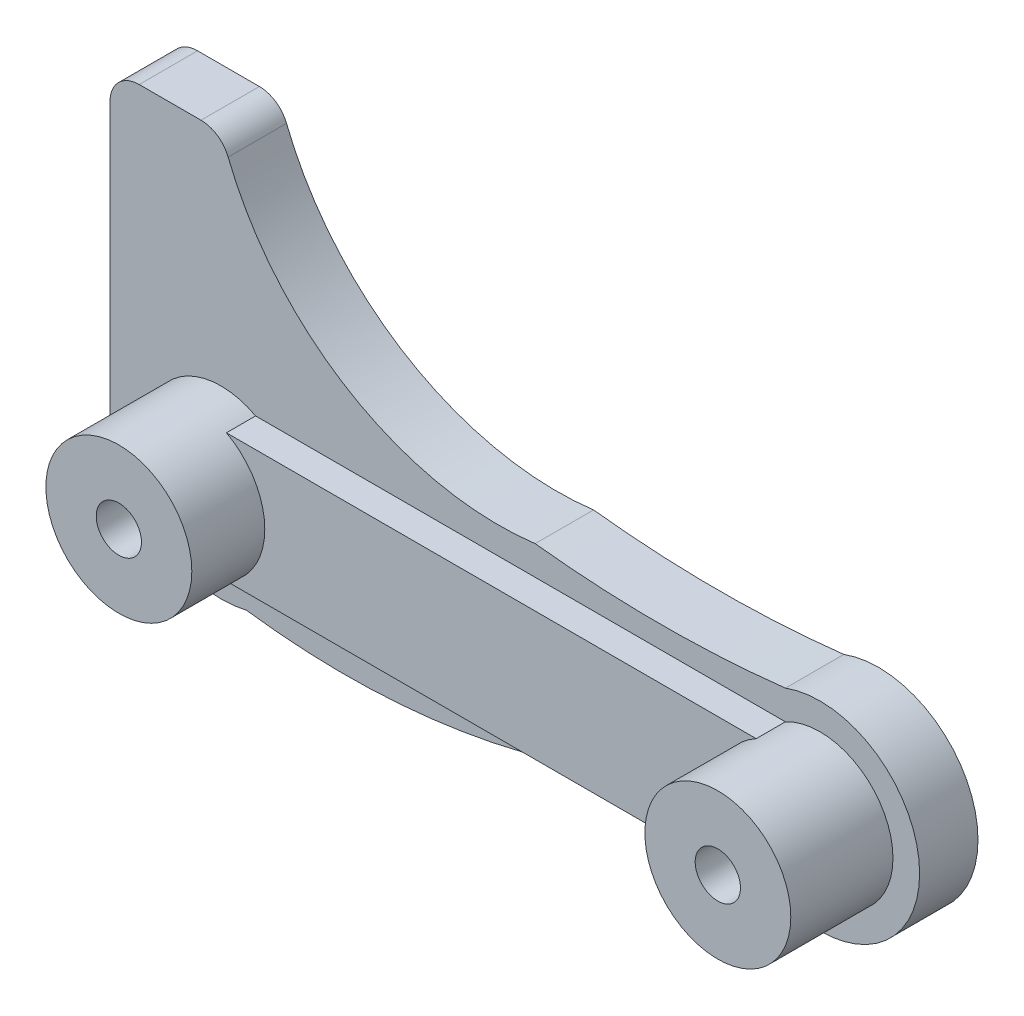
ISO-10303-21;
HEADER;
FILE_DESCRIPTION(('STEP AP214'),'2;1');
FILE_NAME('part.step','',(''),(''),'','','');
FILE_SCHEMA(('AUTOMOTIVE_DESIGN { 1 0 10303 214 1 1 1 1 }'));
ENDSEC;
DATA;
#1=APPLICATION_CONTEXT('core data for automotive mechanical design processes');
#2=APPLICATION_PROTOCOL_DEFINITION('international standard','automotive_design',2000,#1);
#3=PRODUCT_CONTEXT('',#1,'mechanical');
#4=PRODUCT('Part','Part','',(#3));
#5=PRODUCT_RELATED_PRODUCT_CATEGORY('part','',(#4));
#6=PRODUCT_DEFINITION_FORMATION('','',#4);
#7=PRODUCT_DEFINITION_CONTEXT('part definition',#1,'design');
#8=PRODUCT_DEFINITION('design','',#6,#7);
#9=PRODUCT_DEFINITION_SHAPE('','',#8);
#10=(LENGTH_UNIT() NAMED_UNIT(*) SI_UNIT(.MILLI.,.METRE.));
#11=(NAMED_UNIT(*) PLANE_ANGLE_UNIT() SI_UNIT($,.RADIAN.));
#12=(NAMED_UNIT(*) SI_UNIT($,.STERADIAN.) SOLID_ANGLE_UNIT());
#13=UNCERTAINTY_MEASURE_WITH_UNIT(LENGTH_MEASURE(1.E-05),#10,'distance_accuracy_value','');
#14=(GEOMETRIC_REPRESENTATION_CONTEXT(3) GLOBAL_UNCERTAINTY_ASSIGNED_CONTEXT((#13)) GLOBAL_UNIT_ASSIGNED_CONTEXT((#10,
#11,#12)) REPRESENTATION_CONTEXT('',''));
#15=CARTESIAN_POINT('',(0.,0.,0.));
#16=DIRECTION('',(0.,0.,1.));
#17=DIRECTION('',(1.,0.,0.));
#18=AXIS2_PLACEMENT_3D('',#15,#16,#17);
#19=CARTESIAN_POINT('',(0.,0.,-3.));
#20=DIRECTION('',(0.,0.,1.));
#21=DIRECTION('',(1.,0.,0.));
#22=AXIS2_PLACEMENT_3D('',#19,#20,#21);
#23=CYLINDRICAL_SURFACE('',#22,5.);
#24=CARTESIAN_POINT('',(0.,0.,8.));
#25=DIRECTION('',(0.,0.,1.));
#26=DIRECTION('',(1.,0.,0.));
#27=AXIS2_PLACEMENT_3D('',#24,#25,#26);
#28=CIRCLE('',#27,5.);
#29=CARTESIAN_POINT('',(5.,0.,8.));
#30=VERTEX_POINT('',#29);
#31=EDGE_CURVE('E240',#30,#30,#28,.T.);
#32=ORIENTED_EDGE('',*,*,#31,.F.);
#33=EDGE_LOOP('',(#32));
#34=FACE_BOUND('',#33,.T.);
#35=DIRECTION('',(0.,0.,1.));
#36=VECTOR('',#35,1.);
#37=CARTESIAN_POINT('',(2.37053256527719,4.40233748785351,-3.));
#38=LINE('',#37,#36);
#39=CARTESIAN_POINT('',(2.37053256527719,4.40233748785351,1.));
#40=VERTEX_POINT('',#39);
#41=CARTESIAN_POINT('',(2.37053256527719,4.40233748785351,3.));
#42=VERTEX_POINT('',#41);
#43=EDGE_CURVE('E148',#40,#42,#38,.T.);
#44=ORIENTED_EDGE('',*,*,#43,.F.);
#45=CARTESIAN_POINT('',(0.,0.,1.));
#46=DIRECTION('',(0.,0.,-1.));
#47=DIRECTION('',(1.,0.,0.));
#48=AXIS2_PLACEMENT_3D('',#45,#46,#47);
#49=CIRCLE('',#48,5.);
#50=CARTESIAN_POINT('',(2.37053256527719,-4.40233748785352,1.));
#51=VERTEX_POINT('',#50);
#52=EDGE_CURVE('E133',#51,#40,#49,.T.);
#53=ORIENTED_EDGE('',*,*,#52,.F.);
#54=DIRECTION('',(0.,0.,1.));
#55=VECTOR('',#54,1.);
#56=CARTESIAN_POINT('',(2.37053256527719,-4.40233748785351,-3.));
#57=LINE('',#56,#55);
#58=CARTESIAN_POINT('',(2.37053256527719,-4.40233748785351,3.));
#59=VERTEX_POINT('',#58);
#60=EDGE_CURVE('E166',#51,#59,#57,.T.);
#61=ORIENTED_EDGE('',*,*,#60,.T.);
#62=CARTESIAN_POINT('',(0.,0.,3.));
#63=DIRECTION('',(0.,0.,1.));
#64=DIRECTION('',(1.,0.,0.));
#65=AXIS2_PLACEMENT_3D('',#62,#63,#64);
#66=CIRCLE('',#65,5.);
#67=EDGE_CURVE('E155',#59,#42,#66,.T.);
#68=ORIENTED_EDGE('',*,*,#67,.T.);
#69=EDGE_LOOP('',(#44,#53,#61,#68));
#70=FACE_BOUND('',#69,.T.);
#71=ADVANCED_FACE('F33',(#34,#70),#23,.T.);
#72=CARTESIAN_POINT('',(2.37053256527719,4.40233748785351,-3.));
#73=DIRECTION('',(0.,1.,0.));
#74=DIRECTION('',(0.,0.,1.));
#75=AXIS2_PLACEMENT_3D('',#72,#73,#74);
#76=PLANE('',#75);
#77=DIRECTION('',(0.,0.,1.));
#78=VECTOR('',#77,1.);
#79=CARTESIAN_POINT('',(38.6705325652772,4.40233748785351,-3.));
#80=LINE('',#79,#78);
#81=CARTESIAN_POINT('',(38.6705325652772,4.40233748785351,1.));
#82=VERTEX_POINT('',#81);
#83=CARTESIAN_POINT('',(38.6705325652772,4.40233748785352,3.));
#84=VERTEX_POINT('',#83);
#85=EDGE_CURVE('E150',#82,#84,#80,.T.);
#86=ORIENTED_EDGE('',*,*,#85,.F.);
#87=DIRECTION('',(1.,0.,0.));
#88=VECTOR('',#87,1.);
#89=CARTESIAN_POINT('',(38.6705325652772,4.40233748785351,1.));
#90=LINE('',#89,#88);
#91=EDGE_CURVE('E136',#40,#82,#90,.T.);
#92=ORIENTED_EDGE('',*,*,#91,.F.);
#93=ORIENTED_EDGE('',*,*,#43,.T.);
#94=DIRECTION('',(-1.,0.,0.));
#95=VECTOR('',#94,1.);
#96=CARTESIAN_POINT('',(2.37053256527719,4.40233748785351,3.));
#97=LINE('',#96,#95);
#98=EDGE_CURVE('E162',#84,#42,#97,.T.);
#99=ORIENTED_EDGE('',*,*,#98,.F.);
#100=EDGE_LOOP('',(#86,#92,#93,#99));
#101=FACE_BOUND('',#100,.T.);
#102=ADVANCED_FACE('F146',(#101),#76,.T.);
#103=CARTESIAN_POINT('',(41.0410651305544,0.,-3.));
#104=DIRECTION('',(0.,0.,1.));
#105=DIRECTION('',(1.,0.,0.));
#106=AXIS2_PLACEMENT_3D('',#103,#104,#105);
#107=CYLINDRICAL_SURFACE('',#106,5.);
#108=CARTESIAN_POINT('',(41.0410651305544,0.,8.));
#109=DIRECTION('',(0.,0.,1.));
#110=DIRECTION('',(1.,0.,0.));
#111=AXIS2_PLACEMENT_3D('',#108,#109,#110);
#112=CIRCLE('',#111,5.);
#113=CARTESIAN_POINT('',(46.0410651305544,0.,8.));
#114=VERTEX_POINT('',#113);
#115=EDGE_CURVE('E232',#114,#114,#112,.T.);
#116=ORIENTED_EDGE('',*,*,#115,.F.);
#117=EDGE_LOOP('',(#116));
#118=FACE_BOUND('',#117,.T.);
#119=DIRECTION('',(0.,0.,1.));
#120=VECTOR('',#119,1.);
#121=CARTESIAN_POINT('',(38.6705325652772,-4.40233748785351,-3.));
#122=LINE('',#121,#120);
#123=CARTESIAN_POINT('',(38.6705325652772,-4.40233748785351,1.));
#124=VERTEX_POINT('',#123);
#125=CARTESIAN_POINT('',(38.6705325652772,-4.40233748785351,3.));
#126=VERTEX_POINT('',#125);
#127=EDGE_CURVE('E159',#124,#126,#122,.T.);
#128=ORIENTED_EDGE('',*,*,#127,.F.);
#129=CARTESIAN_POINT('',(41.0410651305544,0.,1.));
#130=DIRECTION('',(0.,0.,-1.));
#131=DIRECTION('',(-1.,0.,0.));
#132=AXIS2_PLACEMENT_3D('',#129,#130,#131);
#133=CIRCLE('',#132,5.);
#134=EDGE_CURVE('E257',#82,#124,#133,.T.);
#135=ORIENTED_EDGE('',*,*,#134,.F.);
#136=ORIENTED_EDGE('',*,*,#85,.T.);
#137=CARTESIAN_POINT('',(41.0410651305544,0.,3.));
#138=DIRECTION('',(0.,0.,1.));
#139=DIRECTION('',(1.,0.,0.));
#140=AXIS2_PLACEMENT_3D('',#137,#138,#139);
#141=CIRCLE('',#140,5.);
#142=EDGE_CURVE('E231',#84,#126,#141,.T.);
#143=ORIENTED_EDGE('',*,*,#142,.T.);
#144=EDGE_LOOP('',(#128,#135,#136,#143));
#145=FACE_BOUND('',#144,.T.);
#146=ADVANCED_FACE('F256',(#118,#145),#107,.T.);
#147=CARTESIAN_POINT('',(2.37053256527719,-4.40233748785351,-3.));
#148=DIRECTION('',(0.,-1.,0.));
#149=DIRECTION('',(0.,0.,-1.));
#150=AXIS2_PLACEMENT_3D('',#147,#148,#149);
#151=PLANE('',#150);
#152=ORIENTED_EDGE('',*,*,#60,.F.);
#153=DIRECTION('',(-1.,0.,0.));
#154=VECTOR('',#153,1.);
#155=CARTESIAN_POINT('',(38.6705325652772,-4.40233748785351,1.));
#156=LINE('',#155,#154);
#157=EDGE_CURVE('E139',#124,#51,#156,.T.);
#158=ORIENTED_EDGE('',*,*,#157,.F.);
#159=ORIENTED_EDGE('',*,*,#127,.T.);
#160=DIRECTION('',(1.,0.,0.));
#161=VECTOR('',#160,1.);
#162=CARTESIAN_POINT('',(2.37053256527719,-4.40233748785351,3.));
#163=LINE('',#162,#161);
#164=EDGE_CURVE('E247',#59,#126,#163,.T.);
#165=ORIENTED_EDGE('',*,*,#164,.F.);
#166=EDGE_LOOP('',(#152,#158,#159,#165));
#167=FACE_BOUND('',#166,.T.);
#168=ADVANCED_FACE('F326',(#167),#151,.T.);
#169=CARTESIAN_POINT('',(0.,0.,3.));
#170=DIRECTION('',(0.,0.,1.));
#171=DIRECTION('',(1.,0.,0.));
#172=AXIS2_PLACEMENT_3D('',#169,#170,#171);
#173=PLANE('',#172);
#174=ORIENTED_EDGE('',*,*,#164,.T.);
#175=ORIENTED_EDGE('',*,*,#142,.F.);
#176=ORIENTED_EDGE('',*,*,#98,.T.);
#177=ORIENTED_EDGE('',*,*,#67,.F.);
#178=EDGE_LOOP('',(#174,#175,#176,#177));
#179=FACE_BOUND('',#178,.T.);
#180=ADVANCED_FACE('F253',(#179),#173,.T.);
#181=CARTESIAN_POINT('',(0.,0.,-3.));
#182=DIRECTION('',(0.,0.,1.));
#183=DIRECTION('',(1.,0.,0.));
#184=AXIS2_PLACEMENT_3D('',#181,#182,#183);
#185=PLANE('',#184);
#186=CARTESIAN_POINT('',(41.0410651305544,0.,-3.));
#187=DIRECTION('',(0.,0.,1.));
#188=DIRECTION('',(1.,0.,0.));
#189=AXIS2_PLACEMENT_3D('',#186,#187,#188);
#190=CIRCLE('',#189,1.55);
#191=CARTESIAN_POINT('',(42.5910651305544,0.,-3.));
#192=VERTEX_POINT('',#191);
#193=EDGE_CURVE('E244',#192,#192,#190,.F.);
#194=ORIENTED_EDGE('',*,*,#193,.F.);
#195=EDGE_LOOP('',(#194));
#196=FACE_BOUND('',#195,.T.);
#197=CARTESIAN_POINT('',(0.,0.,-3.));
#198=DIRECTION('',(0.,0.,1.));
#199=DIRECTION('',(1.,0.,0.));
#200=AXIS2_PLACEMENT_3D('',#197,#198,#199);
#201=CIRCLE('',#200,1.55);
#202=CARTESIAN_POINT('',(1.55,0.,-3.));
#203=VERTEX_POINT('',#202);
#204=EDGE_CURVE('E242',#203,#203,#201,.F.);
#205=ORIENTED_EDGE('',*,*,#204,.F.);
#206=EDGE_LOOP('',(#205));
#207=FACE_BOUND('',#206,.T.);
#208=DIRECTION('',(0.,1.,0.));
#209=VECTOR('',#208,1.);
#210=CARTESIAN_POINT('',(-7.60433936531934,20.0804105027613,-3.));
#211=LINE('',#210,#209);
#212=CARTESIAN_POINT('',(-7.60433936531935,-0.784525768646958,-3.));
#213=VERTEX_POINT('',#212);
#214=CARTESIAN_POINT('',(-7.60433936531934,18.0804105027612,-3.));
#215=VERTEX_POINT('',#214);
#216=EDGE_CURVE('E203',#213,#215,#211,.T.);
#217=ORIENTED_EDGE('',*,*,#216,.T.);
#218=CARTESIAN_POINT('',(-5.60433936531934,18.0804105027612,-3.));
#219=DIRECTION('',(0.,0.,1.));
#220=DIRECTION('',(1.,0.,0.));
#221=AXIS2_PLACEMENT_3D('',#218,#219,#220);
#222=CIRCLE('',#221,2.);
#223=CARTESIAN_POINT('',(-5.60433936531934,20.0804105027613,-3.));
#224=VERTEX_POINT('',#223);
#225=EDGE_CURVE('E172',#215,#224,#222,.F.);
#226=ORIENTED_EDGE('',*,*,#225,.T.);
#227=DIRECTION('',(1.,0.,0.));
#228=VECTOR('',#227,1.);
#229=CARTESIAN_POINT('',(0.0362783686385973,20.0804105027613,-3.));
#230=LINE('',#229,#228);
#231=CARTESIAN_POINT('',(-1.36846416227173,20.0804105027613,-3.));
#232=VERTEX_POINT('',#231);
#233=EDGE_CURVE('E201',#224,#232,#230,.T.);
#234=ORIENTED_EDGE('',*,*,#233,.T.);
#235=CARTESIAN_POINT('',(-1.36846416227173,18.0804105027612,-3.));
#236=DIRECTION('',(0.,0.,1.));
#237=DIRECTION('',(1.,0.,0.));
#238=AXIS2_PLACEMENT_3D('',#235,#236,#237);
#239=CIRCLE('',#238,2.);
#240=CARTESIAN_POINT('',(0.489662981532919,18.8202507000041,-3.));
#241=VERTEX_POINT('',#240);
#242=EDGE_CURVE('E170',#232,#241,#239,.F.);
#243=ORIENTED_EDGE('',*,*,#242,.T.);
#244=CARTESIAN_POINT('',(19.0311123356205,26.2027969337399,-3.));
#245=DIRECTION('',(0.,0.,1.));
#246=DIRECTION('',(-1.,0.,0.));
#247=AXIS2_PLACEMENT_3D('',#244,#245,#246);
#248=CIRCLE('',#247,19.9571373960156);
#249=CARTESIAN_POINT('',(21.5269366033226,6.40233748785351,-3.));
#250=VERTEX_POINT('',#249);
#251=EDGE_CURVE('E207',#241,#250,#248,.T.);
#252=ORIENTED_EDGE('',*,*,#251,.T.);
#253=CARTESIAN_POINT('',(30.0987345842999,81.2103515926563,-3.));
#254=DIRECTION('',(0.,0.,1.));
#255=DIRECTION('',(-1.,0.,0.));
#256=AXIS2_PLACEMENT_3D('',#253,#254,#255);
#257=CIRCLE('',#256,75.2975078932302);
#258=CARTESIAN_POINT('',(38.6705325652772,6.40233748785351,-3.));
#259=VERTEX_POINT('',#258);
#260=EDGE_CURVE('E151',#250,#259,#257,.T.);
#261=ORIENTED_EDGE('',*,*,#260,.T.);
#262=CARTESIAN_POINT('',(41.0410651305544,0.,-3.));
#263=DIRECTION('',(0.,0.,-1.));
#264=DIRECTION('',(-1.,0.,0.));
#265=AXIS2_PLACEMENT_3D('',#262,#263,#264);
#266=CIRCLE('',#265,6.82710406771524);
#267=CARTESIAN_POINT('',(38.6705325652772,-6.40233748785351,-3.));
#268=VERTEX_POINT('',#267);
#269=EDGE_CURVE('E277',#259,#268,#266,.T.);
#270=ORIENTED_EDGE('',*,*,#269,.T.);
#271=CARTESIAN_POINT('',(29.6567256455235,-67.5906740117459,-3.));
#272=DIRECTION('',(0.,0.,1.));
#273=DIRECTION('',(1.,0.,0.));
#274=AXIS2_PLACEMENT_3D('',#271,#272,#273);
#275=CIRCLE('',#274,61.8486963625564);
#276=CARTESIAN_POINT('',(20.6429187257697,-6.40233748785351,-3.));
#277=VERTEX_POINT('',#276);
#278=EDGE_CURVE('E280',#268,#277,#275,.T.);
#279=ORIENTED_EDGE('',*,*,#278,.T.);
#280=CARTESIAN_POINT('',(8.46526155420094,42.6067510742454,-3.));
#281=DIRECTION('',(0.,0.,-1.));
#282=DIRECTION('',(-1.,0.,0.));
#283=AXIS2_PLACEMENT_3D('',#280,#281,#282);
#284=CIRCLE('',#283,50.4993672819365);
#285=CARTESIAN_POINT('',(1.74340619525031,-7.44325148728562,-3.));
#286=VERTEX_POINT('',#285);
#287=EDGE_CURVE('E283',#277,#286,#284,.T.);
#288=ORIENTED_EDGE('',*,*,#287,.T.);
#289=CARTESIAN_POINT('',(0.,0.,-3.));
#290=DIRECTION('',(0.,0.,-1.));
#291=DIRECTION('',(1.,0.,0.));
#292=AXIS2_PLACEMENT_3D('',#289,#290,#291);
#293=CIRCLE('',#292,7.64470129335454);
#294=EDGE_CURVE('E211',#286,#213,#293,.T.);
#295=ORIENTED_EDGE('',*,*,#294,.T.);
#296=EDGE_LOOP('',(#217,#226,#234,#243,#252,#261,#270,#279,#288,#295));
#297=FACE_BOUND('',#296,.T.);
#298=ADVANCED_FACE('F200',(#196,#207,#297),#185,.F.);
#299=CARTESIAN_POINT('',(0.,0.,-7.3840620433566));
#300=DIRECTION('',(0.,0.,1.));
#301=DIRECTION('',(1.,0.,0.));
#302=AXIS2_PLACEMENT_3D('',#299,#300,#301);
#303=CYLINDRICAL_SURFACE('',#302,1.55);
#304=CARTESIAN_POINT('',(0.,0.,8.));
#305=DIRECTION('',(0.,0.,1.));
#306=DIRECTION('',(1.,0.,0.));
#307=AXIS2_PLACEMENT_3D('',#304,#305,#306);
#308=CIRCLE('',#307,1.55);
#309=CARTESIAN_POINT('',(1.55,0.,8.));
#310=VERTEX_POINT('',#309);
#311=EDGE_CURVE('E235',#310,#310,#308,.T.);
#312=CARTESIAN_POINT('',(1.55,0.,-3.));
#313=CARTESIAN_POINT('',(1.55,0.,-2.88541666666667));
#314=CARTESIAN_POINT('',(1.55,0.,-2.77083333333333));
#315=CARTESIAN_POINT('',(1.55,0.,-2.54166666666667));
#316=CARTESIAN_POINT('',(1.55,0.,-2.42708333333333));
#317=CARTESIAN_POINT('',(1.55,0.,-2.19791666666667));
#318=CARTESIAN_POINT('',(1.55,0.,-2.08333333333333));
#319=CARTESIAN_POINT('',(1.55,0.,-1.85416666666667));
#320=CARTESIAN_POINT('',(1.55,0.,-1.73958333333333));
#321=CARTESIAN_POINT('',(1.55,0.,-1.51041666666667));
#322=CARTESIAN_POINT('',(1.55,0.,-1.39583333333333));
#323=CARTESIAN_POINT('',(1.55,0.,-1.16666666666667));
#324=CARTESIAN_POINT('',(1.55,0.,-1.05208333333333));
#325=CARTESIAN_POINT('',(1.55,0.,-0.822916666666667));
#326=CARTESIAN_POINT('',(1.55,0.,-0.708333333333334));
#327=CARTESIAN_POINT('',(1.55,0.,-0.479166666666667));
#328=CARTESIAN_POINT('',(1.55,0.,-0.364583333333334));
#329=CARTESIAN_POINT('',(1.55,0.,-0.135416666666668));
#330=CARTESIAN_POINT('',(1.55,0.,-0.0208333333333348));
#331=CARTESIAN_POINT('',(1.55,0.,0.208333333333331));
#332=CARTESIAN_POINT('',(1.55,0.,0.322916666666665));
#333=CARTESIAN_POINT('',(1.55,0.,0.552083333333331));
#334=CARTESIAN_POINT('',(1.55,0.,0.666666666666665));
#335=CARTESIAN_POINT('',(1.55,0.,0.895833333333331));
#336=CARTESIAN_POINT('',(1.55,0.,1.01041666666666));
#337=CARTESIAN_POINT('',(1.55,0.,1.23958333333333));
#338=CARTESIAN_POINT('',(1.55,0.,1.35416666666667));
#339=CARTESIAN_POINT('',(1.55,0.,1.58333333333333));
#340=CARTESIAN_POINT('',(1.55,0.,1.69791666666667));
#341=CARTESIAN_POINT('',(1.55,0.,1.92708333333333));
#342=CARTESIAN_POINT('',(1.55,0.,2.04166666666666));
#343=CARTESIAN_POINT('',(1.55,0.,2.27083333333333));
#344=CARTESIAN_POINT('',(1.55,0.,2.38541666666666));
#345=CARTESIAN_POINT('',(1.55,0.,2.61458333333333));
#346=CARTESIAN_POINT('',(1.55,0.,2.72916666666666));
#347=CARTESIAN_POINT('',(1.55,0.,2.95833333333333));
#348=CARTESIAN_POINT('',(1.55,0.,3.07291666666666));
#349=CARTESIAN_POINT('',(1.55,0.,3.30208333333333));
#350=CARTESIAN_POINT('',(1.55,0.,3.41666666666666));
#351=CARTESIAN_POINT('',(1.55,0.,3.64583333333333));
#352=CARTESIAN_POINT('',(1.55,0.,3.76041666666666));
#353=CARTESIAN_POINT('',(1.55,0.,3.98958333333333));
#354=CARTESIAN_POINT('',(1.55,0.,4.10416666666666));
#355=CARTESIAN_POINT('',(1.55,0.,4.33333333333333));
#356=CARTESIAN_POINT('',(1.55,0.,4.44791666666666));
#357=CARTESIAN_POINT('',(1.55,0.,4.67708333333333));
#358=CARTESIAN_POINT('',(1.55,0.,4.79166666666666));
#359=CARTESIAN_POINT('',(1.55,0.,5.02083333333333));
#360=CARTESIAN_POINT('',(1.55,0.,5.13541666666667));
#361=CARTESIAN_POINT('',(1.55,0.,5.36458333333333));
#362=CARTESIAN_POINT('',(1.55,0.,5.47916666666666));
#363=CARTESIAN_POINT('',(1.55,0.,5.70833333333333));
#364=CARTESIAN_POINT('',(1.55,0.,5.82291666666666));
#365=CARTESIAN_POINT('',(1.55,0.,6.05208333333333));
#366=CARTESIAN_POINT('',(1.55,0.,6.16666666666666));
#367=CARTESIAN_POINT('',(1.55,0.,6.39583333333333));
#368=CARTESIAN_POINT('',(1.55,0.,6.51041666666666));
#369=CARTESIAN_POINT('',(1.55,0.,6.73958333333333));
#370=CARTESIAN_POINT('',(1.55,0.,6.85416666666666));
#371=CARTESIAN_POINT('',(1.55,0.,7.08333333333333));
#372=CARTESIAN_POINT('',(1.55,0.,7.19791666666666));
#373=CARTESIAN_POINT('',(1.55,0.,7.42708333333333));
#374=CARTESIAN_POINT('',(1.55,0.,7.54166666666666));
#375=CARTESIAN_POINT('',(1.55,0.,7.77083333333333));
#376=CARTESIAN_POINT('',(1.55,0.,7.88541666666666));
#377=CARTESIAN_POINT('',(1.55,0.,8.));
#378=B_SPLINE_CURVE_WITH_KNOTS('',3,(#312,#313,#314,#315,#316,#317,#318,#319,#320,#321,#322,
#323,#324,#325,#326,#327,#328,#329,#330,#331,#332,#333,#334,#335,#336,#337,#338,#339,#340,#341,
#342,#343,#344,#345,#346,#347,#348,#349,#350,#351,#352,#353,#354,#355,#356,#357,#358,#359,#360,
#361,#362,#363,#364,#365,#366,#367,#368,#369,#370,#371,#372,#373,#374,#375,#376,#377),
.UNSPECIFIED.,.F.,.F.,(4,2,2,2,2,2,2,2,2,2,2,2,2,2,2,2,2,2,2,2,2,2,2,2,2,2,2,2,2,2,2,2,4),(0.,
0.34375,0.6875,1.03125,1.375,1.71875,2.0625,2.40625,2.75,3.09375,3.4375,3.78125,4.125,4.46875,
4.8125,5.15625,5.5,5.84375,6.1875,6.53125,6.875,7.21875,7.5625,7.90625,8.25,8.59375,8.9375,
9.28125,9.625,9.96875,10.3125,10.65625,11.),.UNSPECIFIED.);
#379=EDGE_CURVE('BSEAM353',#203,#310,#378,.T.);
#380=ORIENTED_EDGE('',*,*,#204,.T.);
#381=ORIENTED_EDGE('',*,*,#311,.T.);
#382=ORIENTED_EDGE('',*,*,#379,.T.);
#383=ORIENTED_EDGE('',*,*,#379,.F.);
#384=EDGE_LOOP('',(#380,#382,#381,#383));
#385=FACE_BOUND('',#384,.T.);
#386=ADVANCED_FACE('F353',(#385),#303,.F.);
#387=CARTESIAN_POINT('',(41.0410651305544,0.,-7.3840620433566));
#388=DIRECTION('',(0.,0.,1.));
#389=DIRECTION('',(1.,0.,0.));
#390=AXIS2_PLACEMENT_3D('',#387,#388,#389);
#391=CYLINDRICAL_SURFACE('',#390,1.55);
#392=CARTESIAN_POINT('',(41.0410651305544,0.,8.));
#393=DIRECTION('',(0.,0.,1.));
#394=DIRECTION('',(1.,0.,0.));
#395=AXIS2_PLACEMENT_3D('',#392,#393,#394);
#396=CIRCLE('',#395,1.55);
#397=CARTESIAN_POINT('',(42.5910651305544,0.,8.));
#398=VERTEX_POINT('',#397);
#399=EDGE_CURVE('E218',#398,#398,#396,.T.);
#400=CARTESIAN_POINT('',(42.5910651305544,0.,-3.));
#401=CARTESIAN_POINT('',(42.5910651305544,0.,-2.88541666666667));
#402=CARTESIAN_POINT('',(42.5910651305544,0.,-2.77083333333333));
#403=CARTESIAN_POINT('',(42.5910651305544,0.,-2.54166666666667));
#404=CARTESIAN_POINT('',(42.5910651305544,0.,-2.42708333333333));
#405=CARTESIAN_POINT('',(42.5910651305544,0.,-2.19791666666667));
#406=CARTESIAN_POINT('',(42.5910651305544,0.,-2.08333333333333));
#407=CARTESIAN_POINT('',(42.5910651305544,0.,-1.85416666666667));
#408=CARTESIAN_POINT('',(42.5910651305544,0.,-1.73958333333333));
#409=CARTESIAN_POINT('',(42.5910651305544,0.,-1.51041666666667));
#410=CARTESIAN_POINT('',(42.5910651305544,0.,-1.39583333333333));
#411=CARTESIAN_POINT('',(42.5910651305544,0.,-1.16666666666667));
#412=CARTESIAN_POINT('',(42.5910651305544,0.,-1.05208333333333));
#413=CARTESIAN_POINT('',(42.5910651305544,0.,-0.822916666666667));
#414=CARTESIAN_POINT('',(42.5910651305544,0.,-0.708333333333334));
#415=CARTESIAN_POINT('',(42.5910651305544,0.,-0.479166666666667));
#416=CARTESIAN_POINT('',(42.5910651305544,0.,-0.364583333333334));
#417=CARTESIAN_POINT('',(42.5910651305544,0.,-0.135416666666668));
#418=CARTESIAN_POINT('',(42.5910651305544,0.,-0.0208333333333348));
#419=CARTESIAN_POINT('',(42.5910651305544,0.,0.208333333333331));
#420=CARTESIAN_POINT('',(42.5910651305544,0.,0.322916666666665));
#421=CARTESIAN_POINT('',(42.5910651305544,0.,0.552083333333331));
#422=CARTESIAN_POINT('',(42.5910651305544,0.,0.666666666666665));
#423=CARTESIAN_POINT('',(42.5910651305544,0.,0.895833333333331));
#424=CARTESIAN_POINT('',(42.5910651305544,0.,1.01041666666666));
#425=CARTESIAN_POINT('',(42.5910651305544,0.,1.23958333333333));
#426=CARTESIAN_POINT('',(42.5910651305544,0.,1.35416666666667));
#427=CARTESIAN_POINT('',(42.5910651305544,0.,1.58333333333333));
#428=CARTESIAN_POINT('',(42.5910651305544,0.,1.69791666666667));
#429=CARTESIAN_POINT('',(42.5910651305544,0.,1.92708333333333));
#430=CARTESIAN_POINT('',(42.5910651305544,0.,2.04166666666666));
#431=CARTESIAN_POINT('',(42.5910651305544,0.,2.27083333333333));
#432=CARTESIAN_POINT('',(42.5910651305544,0.,2.38541666666666));
#433=CARTESIAN_POINT('',(42.5910651305544,0.,2.61458333333333));
#434=CARTESIAN_POINT('',(42.5910651305544,0.,2.72916666666666));
#435=CARTESIAN_POINT('',(42.5910651305544,0.,2.95833333333333));
#436=CARTESIAN_POINT('',(42.5910651305544,0.,3.07291666666666));
#437=CARTESIAN_POINT('',(42.5910651305544,0.,3.30208333333333));
#438=CARTESIAN_POINT('',(42.5910651305544,0.,3.41666666666666));
#439=CARTESIAN_POINT('',(42.5910651305544,0.,3.64583333333333));
#440=CARTESIAN_POINT('',(42.5910651305544,0.,3.76041666666666));
#441=CARTESIAN_POINT('',(42.5910651305544,0.,3.98958333333333));
#442=CARTESIAN_POINT('',(42.5910651305544,0.,4.10416666666666));
#443=CARTESIAN_POINT('',(42.5910651305544,0.,4.33333333333333));
#444=CARTESIAN_POINT('',(42.5910651305544,0.,4.44791666666666));
#445=CARTESIAN_POINT('',(42.5910651305544,0.,4.67708333333333));
#446=CARTESIAN_POINT('',(42.5910651305544,0.,4.79166666666666));
#447=CARTESIAN_POINT('',(42.5910651305544,0.,5.02083333333333));
#448=CARTESIAN_POINT('',(42.5910651305544,0.,5.13541666666667));
#449=CARTESIAN_POINT('',(42.5910651305544,0.,5.36458333333333));
#450=CARTESIAN_POINT('',(42.5910651305544,0.,5.47916666666666));
#451=CARTESIAN_POINT('',(42.5910651305544,0.,5.70833333333333));
#452=CARTESIAN_POINT('',(42.5910651305544,0.,5.82291666666666));
#453=CARTESIAN_POINT('',(42.5910651305544,0.,6.05208333333333));
#454=CARTESIAN_POINT('',(42.5910651305544,0.,6.16666666666666));
#455=CARTESIAN_POINT('',(42.5910651305544,0.,6.39583333333333));
#456=CARTESIAN_POINT('',(42.5910651305544,0.,6.51041666666666));
#457=CARTESIAN_POINT('',(42.5910651305544,0.,6.73958333333333));
#458=CARTESIAN_POINT('',(42.5910651305544,0.,6.85416666666666));
#459=CARTESIAN_POINT('',(42.5910651305544,0.,7.08333333333333));
#460=CARTESIAN_POINT('',(42.5910651305544,0.,7.19791666666666));
#461=CARTESIAN_POINT('',(42.5910651305544,0.,7.42708333333333));
#462=CARTESIAN_POINT('',(42.5910651305544,0.,7.54166666666666));
#463=CARTESIAN_POINT('',(42.5910651305544,0.,7.77083333333333));
#464=CARTESIAN_POINT('',(42.5910651305544,0.,7.88541666666666));
#465=CARTESIAN_POINT('',(42.5910651305544,0.,8.));
#466=B_SPLINE_CURVE_WITH_KNOTS('',3,(#400,#401,#402,#403,#404,#405,#406,#407,#408,#409,#410,
#411,#412,#413,#414,#415,#416,#417,#418,#419,#420,#421,#422,#423,#424,#425,#426,#427,#428,#429,
#430,#431,#432,#433,#434,#435,#436,#437,#438,#439,#440,#441,#442,#443,#444,#445,#446,#447,#448,
#449,#450,#451,#452,#453,#454,#455,#456,#457,#458,#459,#460,#461,#462,#463,#464,#465),
.UNSPECIFIED.,.F.,.F.,(4,2,2,2,2,2,2,2,2,2,2,2,2,2,2,2,2,2,2,2,2,2,2,2,2,2,2,2,2,2,2,2,4),(0.,
0.34375,0.6875,1.03125,1.375,1.71875,2.0625,2.40625,2.75,3.09375,3.4375,3.78125,4.125,4.46875,
4.8125,5.15625,5.5,5.84375,6.1875,6.53125,6.875,7.21875,7.5625,7.90625,8.25,8.59375,8.9375,
9.28125,9.625,9.96875,10.3125,10.65625,11.),.UNSPECIFIED.);
#467=EDGE_CURVE('BSEAM349',#192,#398,#466,.T.);
#468=ORIENTED_EDGE('',*,*,#193,.T.);
#469=ORIENTED_EDGE('',*,*,#399,.T.);
#470=ORIENTED_EDGE('',*,*,#467,.T.);
#471=ORIENTED_EDGE('',*,*,#467,.F.);
#472=EDGE_LOOP('',(#468,#470,#469,#471));
#473=FACE_BOUND('',#472,.T.);
#474=ADVANCED_FACE('F349',(#473),#391,.F.);
#475=CARTESIAN_POINT('',(0.,0.,8.));
#476=DIRECTION('',(0.,0.,1.));
#477=DIRECTION('',(1.,0.,0.));
#478=AXIS2_PLACEMENT_3D('',#475,#476,#477);
#479=PLANE('',#478);
#480=ORIENTED_EDGE('',*,*,#31,.T.);
#481=EDGE_LOOP('',(#480));
#482=FACE_BOUND('',#481,.T.);
#483=ORIENTED_EDGE('',*,*,#311,.F.);
#484=EDGE_LOOP('',(#483));
#485=FACE_BOUND('',#484,.T.);
#486=ADVANCED_FACE('F345',(#482,#485),#479,.T.);
#487=CARTESIAN_POINT('',(41.0410651305544,0.,8.));
#488=DIRECTION('',(0.,0.,1.));
#489=DIRECTION('',(1.,0.,0.));
#490=AXIS2_PLACEMENT_3D('',#487,#488,#489);
#491=PLANE('',#490);
#492=ORIENTED_EDGE('',*,*,#115,.T.);
#493=EDGE_LOOP('',(#492));
#494=FACE_BOUND('',#493,.T.);
#495=ORIENTED_EDGE('',*,*,#399,.F.);
#496=EDGE_LOOP('',(#495));
#497=FACE_BOUND('',#496,.T.);
#498=ADVANCED_FACE('F314',(#494,#497),#491,.T.);
#499=CARTESIAN_POINT('',(30.0987345842999,81.2103515926563,1.));
#500=DIRECTION('',(0.,0.,-1.));
#501=DIRECTION('',(-1.,0.,0.));
#502=AXIS2_PLACEMENT_3D('',#499,#500,#501);
#503=CYLINDRICAL_SURFACE('',#502,75.2975078932302);
#504=ORIENTED_EDGE('',*,*,#260,.F.);
#505=DIRECTION('',(0.,0.,-1.));
#506=VECTOR('',#505,1.);
#507=CARTESIAN_POINT('',(21.5269366033226,6.40233748785351,1.));
#508=LINE('',#507,#506);
#509=CARTESIAN_POINT('',(21.5269366033226,6.40233748785351,1.));
#510=VERTEX_POINT('',#509);
#511=EDGE_CURVE('E215',#510,#250,#508,.T.);
#512=ORIENTED_EDGE('',*,*,#511,.F.);
#513=CARTESIAN_POINT('',(30.0987345842999,81.2103515926563,1.));
#514=DIRECTION('',(0.,0.,1.));
#515=DIRECTION('',(-1.,0.,0.));
#516=AXIS2_PLACEMENT_3D('',#513,#514,#515);
#517=CIRCLE('',#516,75.2975078932302);
#518=CARTESIAN_POINT('',(38.6705325652772,6.40233748785351,1.));
#519=VERTEX_POINT('',#518);
#520=EDGE_CURVE('E209',#510,#519,#517,.T.);
#521=ORIENTED_EDGE('',*,*,#520,.T.);
#522=DIRECTION('',(0.,0.,-1.));
#523=VECTOR('',#522,1.);
#524=CARTESIAN_POINT('',(38.6705325652772,6.40233748785351,1.));
#525=LINE('',#524,#523);
#526=EDGE_CURVE('E226',#519,#259,#525,.T.);
#527=ORIENTED_EDGE('',*,*,#526,.T.);
#528=EDGE_LOOP('',(#504,#512,#521,#527));
#529=FACE_BOUND('',#528,.T.);
#530=ADVANCED_FACE('F303',(#529),#503,.F.);
#531=CARTESIAN_POINT('',(19.0311123356205,26.2027969337399,1.));
#532=DIRECTION('',(0.,0.,-1.));
#533=DIRECTION('',(-1.,0.,0.));
#534=AXIS2_PLACEMENT_3D('',#531,#532,#533);
#535=CYLINDRICAL_SURFACE('',#534,19.9571373960156);
#536=ORIENTED_EDGE('',*,*,#251,.F.);
#537=DIRECTION('',(0.,0.,-1.));
#538=VECTOR('',#537,1.);
#539=CARTESIAN_POINT('',(0.489662981532916,18.8202507000041,1.));
#540=LINE('',#539,#538);
#541=CARTESIAN_POINT('',(0.489662981532919,18.8202507000041,1.));
#542=VERTEX_POINT('',#541);
#543=EDGE_CURVE('E11',#241,#542,#540,.F.);
#544=ORIENTED_EDGE('',*,*,#543,.T.);
#545=CARTESIAN_POINT('',(19.0311123356205,26.2027969337399,1.));
#546=DIRECTION('',(0.,0.,1.));
#547=DIRECTION('',(-1.,0.,0.));
#548=AXIS2_PLACEMENT_3D('',#545,#546,#547);
#549=CIRCLE('',#548,19.9571373960156);
#550=EDGE_CURVE('E228',#542,#510,#549,.T.);
#551=ORIENTED_EDGE('',*,*,#550,.T.);
#552=ORIENTED_EDGE('',*,*,#511,.T.);
#553=EDGE_LOOP('',(#536,#544,#551,#552));
#554=FACE_BOUND('',#553,.T.);
#555=ADVANCED_FACE('F306',(#554),#535,.F.);
#556=CARTESIAN_POINT('',(0.0362783686385973,20.0804105027613,1.));
#557=DIRECTION('',(0.,1.,0.));
#558=DIRECTION('',(0.,0.,1.));
#559=AXIS2_PLACEMENT_3D('',#556,#557,#558);
#560=PLANE('',#559);
#561=ORIENTED_EDGE('',*,*,#233,.F.);
#562=DIRECTION('',(0.,0.,-1.));
#563=VECTOR('',#562,1.);
#564=CARTESIAN_POINT('',(-5.60433936531934,20.0804105027613,1.));
#565=LINE('',#564,#563);
#566=CARTESIAN_POINT('',(-5.60433936531934,20.0804105027613,1.));
#567=VERTEX_POINT('',#566);
#568=EDGE_CURVE('E177',#224,#567,#565,.F.);
#569=ORIENTED_EDGE('',*,*,#568,.T.);
#570=DIRECTION('',(1.,0.,0.));
#571=VECTOR('',#570,1.);
#572=CARTESIAN_POINT('',(0.0362783686385973,20.0804105027613,1.));
#573=LINE('',#572,#571);
#574=CARTESIAN_POINT('',(-1.36846416227173,20.0804105027613,1.));
#575=VERTEX_POINT('',#574);
#576=EDGE_CURVE('E185',#567,#575,#573,.T.);
#577=ORIENTED_EDGE('',*,*,#576,.T.);
#578=DIRECTION('',(0.,0.,-1.));
#579=VECTOR('',#578,1.);
#580=CARTESIAN_POINT('',(-1.36846416227173,20.0804105027613,1.));
#581=LINE('',#580,#579);
#582=EDGE_CURVE('E174',#575,#232,#581,.T.);
#583=ORIENTED_EDGE('',*,*,#582,.T.);
#584=EDGE_LOOP('',(#561,#569,#577,#583));
#585=FACE_BOUND('',#584,.T.);
#586=ADVANCED_FACE('F205',(#585),#560,.T.);
#587=CARTESIAN_POINT('',(-7.60433936531934,20.0804105027613,1.));
#588=DIRECTION('',(-1.,0.,0.));
#589=DIRECTION('',(0.,-1.,0.));
#590=AXIS2_PLACEMENT_3D('',#587,#588,#589);
#591=PLANE('',#590);
#592=DIRECTION('',(0.,1.,0.));
#593=VECTOR('',#592,1.);
#594=CARTESIAN_POINT('',(-7.60433936531934,20.0804105027613,1.));
#595=LINE('',#594,#593);
#596=CARTESIAN_POINT('',(-7.60433936531935,-0.784525768646958,1.));
#597=VERTEX_POINT('',#596);
#598=CARTESIAN_POINT('',(-7.60433936531934,18.0804105027612,1.));
#599=VERTEX_POINT('',#598);
#600=EDGE_CURVE('E183',#597,#599,#595,.T.);
#601=ORIENTED_EDGE('',*,*,#600,.T.);
#602=DIRECTION('',(0.,0.,-1.));
#603=VECTOR('',#602,1.);
#604=CARTESIAN_POINT('',(-7.60433936531934,18.0804105027612,1.));
#605=LINE('',#604,#603);
#606=EDGE_CURVE('E157',#599,#215,#605,.T.);
#607=ORIENTED_EDGE('',*,*,#606,.T.);
#608=ORIENTED_EDGE('',*,*,#216,.F.);
#609=DIRECTION('',(0.,0.,-1.));
#610=VECTOR('',#609,1.);
#611=CARTESIAN_POINT('',(-7.60433936531935,-0.784525768646958,1.));
#612=LINE('',#611,#610);
#613=EDGE_CURVE('E193',#597,#213,#612,.T.);
#614=ORIENTED_EDGE('',*,*,#613,.F.);
#615=EDGE_LOOP('',(#601,#607,#608,#614));
#616=FACE_BOUND('',#615,.T.);
#617=ADVANCED_FACE('F190',(#616),#591,.T.);
#618=CARTESIAN_POINT('',(0.,0.,1.));
#619=DIRECTION('',(0.,0.,-1.));
#620=DIRECTION('',(-1.,0.,0.));
#621=AXIS2_PLACEMENT_3D('',#618,#619,#620);
#622=CYLINDRICAL_SURFACE('',#621,7.64470129335454);
#623=ORIENTED_EDGE('',*,*,#294,.F.);
#624=DIRECTION('',(0.,0.,-1.));
#625=VECTOR('',#624,1.);
#626=CARTESIAN_POINT('',(1.74340619525031,-7.44325148728562,1.));
#627=LINE('',#626,#625);
#628=CARTESIAN_POINT('',(1.74340619525031,-7.44325148728562,1.));
#629=VERTEX_POINT('',#628);
#630=EDGE_CURVE('E220',#629,#286,#627,.T.);
#631=ORIENTED_EDGE('',*,*,#630,.F.);
#632=CARTESIAN_POINT('',(0.,0.,1.));
#633=DIRECTION('',(0.,0.,-1.));
#634=DIRECTION('',(1.,0.,0.));
#635=AXIS2_PLACEMENT_3D('',#632,#633,#634);
#636=CIRCLE('',#635,7.64470129335454);
#637=EDGE_CURVE('E194',#629,#597,#636,.T.);
#638=ORIENTED_EDGE('',*,*,#637,.T.);
#639=ORIENTED_EDGE('',*,*,#613,.T.);
#640=EDGE_LOOP('',(#623,#631,#638,#639));
#641=FACE_BOUND('',#640,.T.);
#642=ADVANCED_FACE('F288',(#641),#622,.T.);
#643=CARTESIAN_POINT('',(8.46526155420094,42.6067510742454,1.));
#644=DIRECTION('',(0.,0.,-1.));
#645=DIRECTION('',(-1.,0.,0.));
#646=AXIS2_PLACEMENT_3D('',#643,#644,#645);
#647=CYLINDRICAL_SURFACE('',#646,50.4993672819365);
#648=ORIENTED_EDGE('',*,*,#287,.F.);
#649=DIRECTION('',(0.,0.,-1.));
#650=VECTOR('',#649,1.);
#651=CARTESIAN_POINT('',(20.6429187257697,-6.40233748785351,1.));
#652=LINE('',#651,#650);
#653=CARTESIAN_POINT('',(20.6429187257697,-6.40233748785351,1.));
#654=VERTEX_POINT('',#653);
#655=EDGE_CURVE('E222',#654,#277,#652,.T.);
#656=ORIENTED_EDGE('',*,*,#655,.F.);
#657=CARTESIAN_POINT('',(8.46526155420094,42.6067510742454,1.));
#658=DIRECTION('',(0.,0.,-1.));
#659=DIRECTION('',(-1.,0.,0.));
#660=AXIS2_PLACEMENT_3D('',#657,#658,#659);
#661=CIRCLE('',#660,50.4993672819365);
#662=EDGE_CURVE('E269',#654,#629,#661,.T.);
#663=ORIENTED_EDGE('',*,*,#662,.T.);
#664=ORIENTED_EDGE('',*,*,#630,.T.);
#665=EDGE_LOOP('',(#648,#656,#663,#664));
#666=FACE_BOUND('',#665,.T.);
#667=ADVANCED_FACE('F292',(#666),#647,.T.);
#668=CARTESIAN_POINT('',(29.6567256455235,-67.5906740117459,1.));
#669=DIRECTION('',(0.,0.,-1.));
#670=DIRECTION('',(-1.,0.,0.));
#671=AXIS2_PLACEMENT_3D('',#668,#669,#670);
#672=CYLINDRICAL_SURFACE('',#671,61.8486963625564);
#673=ORIENTED_EDGE('',*,*,#278,.F.);
#674=DIRECTION('',(0.,0.,-1.));
#675=VECTOR('',#674,1.);
#676=CARTESIAN_POINT('',(38.6705325652772,-6.40233748785351,1.));
#677=LINE('',#676,#675);
#678=CARTESIAN_POINT('',(38.6705325652772,-6.40233748785351,1.));
#679=VERTEX_POINT('',#678);
#680=EDGE_CURVE('E224',#679,#268,#677,.T.);
#681=ORIENTED_EDGE('',*,*,#680,.F.);
#682=CARTESIAN_POINT('',(29.6567256455235,-67.5906740117459,1.));
#683=DIRECTION('',(0.,0.,1.));
#684=DIRECTION('',(1.,0.,0.));
#685=AXIS2_PLACEMENT_3D('',#682,#683,#684);
#686=CIRCLE('',#685,61.8486963625564);
#687=EDGE_CURVE('E266',#679,#654,#686,.T.);
#688=ORIENTED_EDGE('',*,*,#687,.T.);
#689=ORIENTED_EDGE('',*,*,#655,.T.);
#690=EDGE_LOOP('',(#673,#681,#688,#689));
#691=FACE_BOUND('',#690,.T.);
#692=ADVANCED_FACE('F295',(#691),#672,.F.);
#693=CARTESIAN_POINT('',(41.0410651305544,0.,1.));
#694=DIRECTION('',(0.,0.,-1.));
#695=DIRECTION('',(-1.,0.,0.));
#696=AXIS2_PLACEMENT_3D('',#693,#694,#695);
#697=CYLINDRICAL_SURFACE('',#696,6.82710406771524);
#698=ORIENTED_EDGE('',*,*,#269,.F.);
#699=ORIENTED_EDGE('',*,*,#526,.F.);
#700=CARTESIAN_POINT('',(41.0410651305544,0.,1.));
#701=DIRECTION('',(0.,0.,-1.));
#702=DIRECTION('',(-1.,0.,0.));
#703=AXIS2_PLACEMENT_3D('',#700,#701,#702);
#704=CIRCLE('',#703,6.82710406771524);
#705=EDGE_CURVE('E263',#519,#679,#704,.T.);
#706=ORIENTED_EDGE('',*,*,#705,.T.);
#707=ORIENTED_EDGE('',*,*,#680,.T.);
#708=EDGE_LOOP('',(#698,#699,#706,#707));
#709=FACE_BOUND('',#708,.T.);
#710=ADVANCED_FACE('F300',(#709),#697,.T.);
#711=CARTESIAN_POINT('',(30.0987345842999,81.2103515926563,1.));
#712=DIRECTION('',(0.,0.,-1.));
#713=DIRECTION('',(-1.,0.,0.));
#714=AXIS2_PLACEMENT_3D('',#711,#712,#713);
#715=PLANE('',#714);
#716=ORIENTED_EDGE('',*,*,#91,.T.);
#717=ORIENTED_EDGE('',*,*,#134,.T.);
#718=ORIENTED_EDGE('',*,*,#157,.T.);
#719=ORIENTED_EDGE('',*,*,#52,.T.);
#720=EDGE_LOOP('',(#716,#717,#718,#719));
#721=FACE_BOUND('',#720,.T.);
#722=ORIENTED_EDGE('',*,*,#576,.F.);
#723=CARTESIAN_POINT('',(-5.60433936531934,18.0804105027612,1.));
#724=DIRECTION('',(0.,0.,-1.));
#725=DIRECTION('',(-1.,0.,0.));
#726=AXIS2_PLACEMENT_3D('',#723,#724,#725);
#727=CIRCLE('',#726,2.);
#728=EDGE_CURVE('E41',#567,#599,#727,.F.);
#729=ORIENTED_EDGE('',*,*,#728,.T.);
#730=ORIENTED_EDGE('',*,*,#600,.F.);
#731=ORIENTED_EDGE('',*,*,#637,.F.);
#732=ORIENTED_EDGE('',*,*,#662,.F.);
#733=ORIENTED_EDGE('',*,*,#687,.F.);
#734=ORIENTED_EDGE('',*,*,#705,.F.);
#735=ORIENTED_EDGE('',*,*,#520,.F.);
#736=ORIENTED_EDGE('',*,*,#550,.F.);
#737=CARTESIAN_POINT('',(-1.36846416227173,18.0804105027612,1.));
#738=DIRECTION('',(0.,0.,-1.));
#739=DIRECTION('',(-1.,0.,0.));
#740=AXIS2_PLACEMENT_3D('',#737,#738,#739);
#741=CIRCLE('',#740,2.);
#742=EDGE_CURVE('E53',#542,#575,#741,.F.);
#743=ORIENTED_EDGE('',*,*,#742,.T.);
#744=EDGE_LOOP('',(#722,#729,#730,#731,#732,#733,#734,#735,#736,#743));
#745=FACE_BOUND('',#744,.T.);
#746=ADVANCED_FACE('F135',(#721,#745),#715,.F.);
#747=CARTESIAN_POINT('',(-5.60433936531934,18.0804105027612,1.));
#748=DIRECTION('',(0.,0.,-1.));
#749=DIRECTION('',(-1.,0.,0.));
#750=AXIS2_PLACEMENT_3D('',#747,#748,#749);
#751=CYLINDRICAL_SURFACE('',#750,2.);
#752=ORIENTED_EDGE('',*,*,#728,.F.);
#753=ORIENTED_EDGE('',*,*,#568,.F.);
#754=ORIENTED_EDGE('',*,*,#225,.F.);
#755=ORIENTED_EDGE('',*,*,#606,.F.);
#756=EDGE_LOOP('',(#752,#753,#754,#755));
#757=FACE_BOUND('',#756,.T.);
#758=ADVANCED_FACE('F196',(#757),#751,.T.);
#759=CARTESIAN_POINT('',(-1.36846416227173,18.0804105027612,1.));
#760=DIRECTION('',(0.,0.,-1.));
#761=DIRECTION('',(-1.,0.,0.));
#762=AXIS2_PLACEMENT_3D('',#759,#760,#761);
#763=CYLINDRICAL_SURFACE('',#762,2.);
#764=ORIENTED_EDGE('',*,*,#742,.F.);
#765=ORIENTED_EDGE('',*,*,#543,.F.);
#766=ORIENTED_EDGE('',*,*,#242,.F.);
#767=ORIENTED_EDGE('',*,*,#582,.F.);
#768=EDGE_LOOP('',(#764,#765,#766,#767));
#769=FACE_BOUND('',#768,.T.);
#770=ADVANCED_FACE('F35',(#769),#763,.T.);
#771=CLOSED_SHELL('',(#71,#102,#146,#168,#180,#298,#386,#474,#486,#498,#530,#555,#586,#617,#642,
#667,#692,#710,#746,#758,#770));
#772=MANIFOLD_SOLID_BREP('B2',#771);
#773=ADVANCED_BREP_SHAPE_REPRESENTATION('',(#18,#772),#14);
#774=SHAPE_DEFINITION_REPRESENTATION(#9,#773);
ENDSEC;
END-ISO-10303-21;
